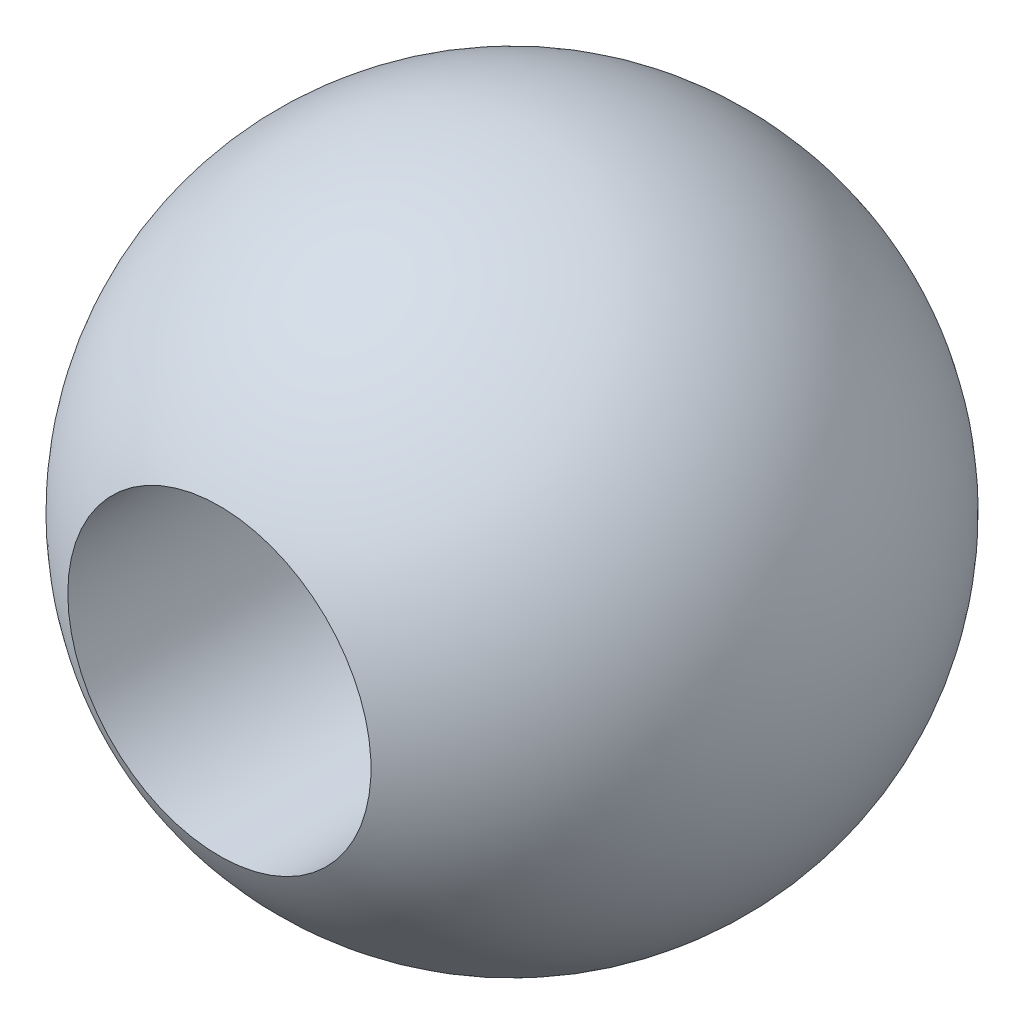
ISO-10303-21;
HEADER;
FILE_DESCRIPTION(('STEP AP214'),'2;1');
FILE_NAME('part.step','',(''),(''),'','','');
FILE_SCHEMA(('AUTOMOTIVE_DESIGN { 1 0 10303 214 1 1 1 1 }'));
ENDSEC;
DATA;
#1=APPLICATION_CONTEXT('core data for automotive mechanical design processes');
#2=APPLICATION_PROTOCOL_DEFINITION('international standard','automotive_design',2000,#1);
#3=PRODUCT_CONTEXT('',#1,'mechanical');
#4=PRODUCT('Part','Part','',(#3));
#5=PRODUCT_RELATED_PRODUCT_CATEGORY('part','',(#4));
#6=PRODUCT_DEFINITION_FORMATION('','',#4);
#7=PRODUCT_DEFINITION_CONTEXT('part definition',#1,'design');
#8=PRODUCT_DEFINITION('design','',#6,#7);
#9=PRODUCT_DEFINITION_SHAPE('','',#8);
#10=(LENGTH_UNIT() NAMED_UNIT(*) SI_UNIT(.MILLI.,.METRE.));
#11=(NAMED_UNIT(*) PLANE_ANGLE_UNIT() SI_UNIT($,.RADIAN.));
#12=(NAMED_UNIT(*) SI_UNIT($,.STERADIAN.) SOLID_ANGLE_UNIT());
#13=UNCERTAINTY_MEASURE_WITH_UNIT(LENGTH_MEASURE(1.E-05),#10,'distance_accuracy_value','');
#14=(GEOMETRIC_REPRESENTATION_CONTEXT(3) GLOBAL_UNCERTAINTY_ASSIGNED_CONTEXT((#13)) GLOBAL_UNIT_ASSIGNED_CONTEXT((#10,
#11,#12)) REPRESENTATION_CONTEXT('',''));
#15=CARTESIAN_POINT('',(0.,0.,0.));
#16=DIRECTION('',(0.,0.,1.));
#17=DIRECTION('',(1.,0.,0.));
#18=AXIS2_PLACEMENT_3D('',#15,#16,#17);
#19=CARTESIAN_POINT('',(0.,0.,0.));
#20=DIRECTION('',(0.,1.,0.));
#21=DIRECTION('',(1.,0.,0.));
#22=AXIS2_PLACEMENT_3D('',#19,#20,#21);
#23=SPHERICAL_SURFACE('',#22,2.5);
#24=CARTESIAN_POINT('',(0.,0.,0.));
#25=DIRECTION('',(0.,0.,-1.));
#26=DIRECTION('',(-1.,0.,0.));
#27=AXIS2_PLACEMENT_3D('',#24,#25,#26);
#28=SPHERICAL_SURFACE('',#27,2.5);
#29=CARTESIAN_POINT('',(0.,0.,2.21979728804231));
#30=DIRECTION('',(0.,0.,-1.));
#31=DIRECTION('',(-1.,0.,0.));
#32=AXIS2_PLACEMENT_3D('',#29,#30,#31);
#33=CIRCLE('',#32,1.15);
#34=CARTESIAN_POINT('',(-1.15,0.,2.21979728804231));
#35=VERTEX_POINT('',#34);
#36=EDGE_CURVE('E10',#35,#35,#33,.F.);
#37=ORIENTED_EDGE('',*,*,#36,.F.);
#38=EDGE_LOOP('',(#37));
#39=FACE_BOUND('',#38,.T.);
#40=CARTESIAN_POINT('',(0.,0.,-2.21979728804231));
#41=DIRECTION('',(0.,0.,1.));
#42=DIRECTION('',(1.,0.,0.));
#43=AXIS2_PLACEMENT_3D('',#40,#41,#42);
#44=CIRCLE('',#43,1.15);
#45=CARTESIAN_POINT('',(1.15,0.,-2.21979728804231));
#46=VERTEX_POINT('',#45);
#47=EDGE_CURVE('E40',#46,#46,#44,.F.);
#48=ORIENTED_EDGE('',*,*,#47,.F.);
#49=EDGE_LOOP('',(#48));
#50=FACE_BOUND('',#49,.T.);
#51=ADVANCED_FACE('F34',(#39,#50),#28,.T.);
#52=CARTESIAN_POINT('',(0.,0.,-5.));
#53=DIRECTION('',(0.,0.,1.));
#54=DIRECTION('',(1.,0.,0.));
#55=AXIS2_PLACEMENT_3D('',#52,#53,#54);
#56=CYLINDRICAL_SURFACE('',#55,1.15);
#57=ORIENTED_EDGE('',*,*,#36,.T.);
#58=EDGE_LOOP('',(#57));
#59=FACE_BOUND('',#58,.T.);
#60=ORIENTED_EDGE('',*,*,#47,.T.);
#61=EDGE_LOOP('',(#60));
#62=FACE_BOUND('',#61,.T.);
#63=ADVANCED_FACE('F46',(#59,#62),#56,.F.);
#64=CLOSED_SHELL('',(#51,#63));
#65=MANIFOLD_SOLID_BREP('B2',#64);
#66=ADVANCED_BREP_SHAPE_REPRESENTATION('',(#18,#65),#14);
#67=SHAPE_DEFINITION_REPRESENTATION(#9,#66);
ENDSEC;
END-ISO-10303-21;
